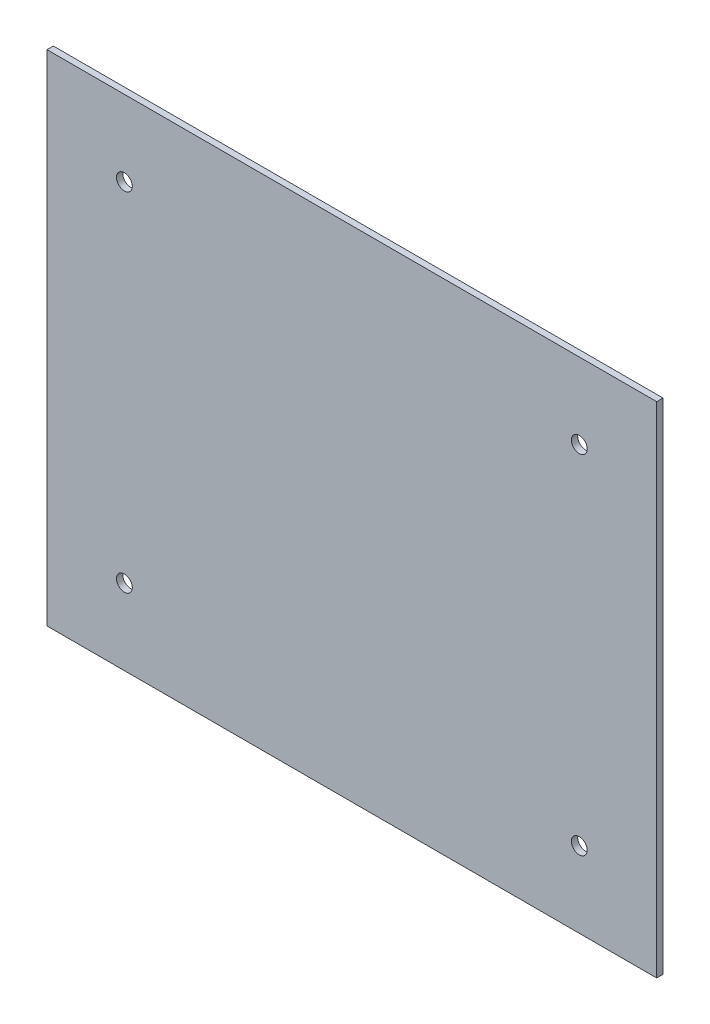
ISO-10303-21;
HEADER;
FILE_DESCRIPTION(('STEP AP214'),'2;1');
FILE_NAME('part.step','',(''),(''),'','','');
FILE_SCHEMA(('AUTOMOTIVE_DESIGN { 1 0 10303 214 1 1 1 1 }'));
ENDSEC;
DATA;
#1=APPLICATION_CONTEXT('core data for automotive mechanical design processes');
#2=APPLICATION_PROTOCOL_DEFINITION('international standard','automotive_design',2000,#1);
#3=PRODUCT_CONTEXT('',#1,'mechanical');
#4=PRODUCT('Part','Part','',(#3));
#5=PRODUCT_RELATED_PRODUCT_CATEGORY('part','',(#4));
#6=PRODUCT_DEFINITION_FORMATION('','',#4);
#7=PRODUCT_DEFINITION_CONTEXT('part definition',#1,'design');
#8=PRODUCT_DEFINITION('design','',#6,#7);
#9=PRODUCT_DEFINITION_SHAPE('','',#8);
#10=(LENGTH_UNIT() NAMED_UNIT(*) SI_UNIT(.MILLI.,.METRE.));
#11=(NAMED_UNIT(*) PLANE_ANGLE_UNIT() SI_UNIT($,.RADIAN.));
#12=(NAMED_UNIT(*) SI_UNIT($,.STERADIAN.) SOLID_ANGLE_UNIT());
#13=UNCERTAINTY_MEASURE_WITH_UNIT(LENGTH_MEASURE(1.E-05),#10,'distance_accuracy_value','');
#14=(GEOMETRIC_REPRESENTATION_CONTEXT(3) GLOBAL_UNCERTAINTY_ASSIGNED_CONTEXT((#13)) GLOBAL_UNIT_ASSIGNED_CONTEXT((#10,
#11,#12)) REPRESENTATION_CONTEXT('',''));
#15=CARTESIAN_POINT('',(0.,0.,0.));
#16=DIRECTION('',(0.,0.,1.));
#17=DIRECTION('',(1.,0.,0.));
#18=AXIS2_PLACEMENT_3D('',#15,#16,#17);
#19=CARTESIAN_POINT('',(0.,0.,1.));
#20=DIRECTION('',(0.,0.,1.));
#21=DIRECTION('',(1.,0.,0.));
#22=AXIS2_PLACEMENT_3D('',#19,#20,#21);
#23=PLANE('',#22);
#24=CARTESIAN_POINT('',(-72.,-55.,1.));
#25=DIRECTION('',(0.,0.,1.));
#26=DIRECTION('',(-1.,0.,0.));
#27=AXIS2_PLACEMENT_3D('',#24,#25,#26);
#28=CIRCLE('',#27,2.49999999999999);
#29=CARTESIAN_POINT('',(-74.5,-55.,1.));
#30=VERTEX_POINT('',#29);
#31=EDGE_CURVE('E115',#30,#30,#28,.T.);
#32=ORIENTED_EDGE('',*,*,#31,.F.);
#33=EDGE_LOOP('',(#32));
#34=FACE_BOUND('',#33,.T.);
#35=CARTESIAN_POINT('',(-72.,55.,1.));
#36=DIRECTION('',(0.,0.,1.));
#37=DIRECTION('',(-1.,0.,0.));
#38=AXIS2_PLACEMENT_3D('',#35,#36,#37);
#39=CIRCLE('',#38,2.49999999999999);
#40=CARTESIAN_POINT('',(-74.5,55.,1.));
#41=VERTEX_POINT('',#40);
#42=EDGE_CURVE('E121',#41,#41,#39,.T.);
#43=ORIENTED_EDGE('',*,*,#42,.F.);
#44=EDGE_LOOP('',(#43));
#45=FACE_BOUND('',#44,.T.);
#46=CARTESIAN_POINT('',(72.,55.,1.));
#47=DIRECTION('',(0.,0.,1.));
#48=DIRECTION('',(1.,0.,0.));
#49=AXIS2_PLACEMENT_3D('',#46,#47,#48);
#50=CIRCLE('',#49,2.49999999999999);
#51=CARTESIAN_POINT('',(74.5,55.,1.));
#52=VERTEX_POINT('',#51);
#53=EDGE_CURVE('E127',#52,#52,#50,.T.);
#54=ORIENTED_EDGE('',*,*,#53,.F.);
#55=EDGE_LOOP('',(#54));
#56=FACE_BOUND('',#55,.T.);
#57=CARTESIAN_POINT('',(72.,-55.,1.));
#58=DIRECTION('',(0.,0.,1.));
#59=DIRECTION('',(1.,0.,0.));
#60=AXIS2_PLACEMENT_3D('',#57,#58,#59);
#61=CIRCLE('',#60,2.49999999999999);
#62=CARTESIAN_POINT('',(74.5,-55.,1.));
#63=VERTEX_POINT('',#62);
#64=EDGE_CURVE('E109',#63,#63,#61,.T.);
#65=ORIENTED_EDGE('',*,*,#64,.F.);
#66=EDGE_LOOP('',(#65));
#67=FACE_BOUND('',#66,.T.);
#68=DIRECTION('',(0.,1.,0.));
#69=VECTOR('',#68,1.);
#70=CARTESIAN_POINT('',(96.5,79.,1.));
#71=LINE('',#70,#69);
#72=CARTESIAN_POINT('',(96.5,-79.,1.));
#73=VERTEX_POINT('',#72);
#74=CARTESIAN_POINT('',(96.5,79.,1.));
#75=VERTEX_POINT('',#74);
#76=EDGE_CURVE('E83',#73,#75,#71,.T.);
#77=ORIENTED_EDGE('',*,*,#76,.T.);
#78=DIRECTION('',(-1.,0.,0.));
#79=VECTOR('',#78,1.);
#80=CARTESIAN_POINT('',(-96.5,78.9999999999999,1.));
#81=LINE('',#80,#79);
#82=CARTESIAN_POINT('',(-96.5,78.9999999999999,1.));
#83=VERTEX_POINT('',#82);
#84=EDGE_CURVE('E79',#75,#83,#81,.T.);
#85=ORIENTED_EDGE('',*,*,#84,.T.);
#86=DIRECTION('',(0.,-1.,0.));
#87=VECTOR('',#86,1.);
#88=CARTESIAN_POINT('',(-96.5,78.9999999999999,1.));
#89=LINE('',#88,#87);
#90=CARTESIAN_POINT('',(-96.5,-79.,1.));
#91=VERTEX_POINT('',#90);
#92=EDGE_CURVE('E81',#83,#91,#89,.T.);
#93=ORIENTED_EDGE('',*,*,#92,.T.);
#94=DIRECTION('',(1.,0.,0.));
#95=VECTOR('',#94,1.);
#96=CARTESIAN_POINT('',(-96.5,-79.,1.));
#97=LINE('',#96,#95);
#98=EDGE_CURVE('E49',#91,#73,#97,.T.);
#99=ORIENTED_EDGE('',*,*,#98,.T.);
#100=EDGE_LOOP('',(#77,#85,#93,#99));
#101=FACE_BOUND('',#100,.T.);
#102=ADVANCED_FACE('F32',(#34,#45,#56,#67,#101),#23,.T.);
#103=CARTESIAN_POINT('',(0.,0.,-1.));
#104=DIRECTION('',(0.,0.,1.));
#105=DIRECTION('',(1.,0.,0.));
#106=AXIS2_PLACEMENT_3D('',#103,#104,#105);
#107=PLANE('',#106);
#108=CARTESIAN_POINT('',(-72.,-55.,-1.));
#109=DIRECTION('',(0.,0.,1.));
#110=DIRECTION('',(-1.,0.,0.));
#111=AXIS2_PLACEMENT_3D('',#108,#109,#110);
#112=CIRCLE('',#111,2.49999999999999);
#113=CARTESIAN_POINT('',(-74.5,-55.,-1.));
#114=VERTEX_POINT('',#113);
#115=EDGE_CURVE('E118',#114,#114,#112,.T.);
#116=ORIENTED_EDGE('',*,*,#115,.T.);
#117=EDGE_LOOP('',(#116));
#118=FACE_BOUND('',#117,.T.);
#119=CARTESIAN_POINT('',(-72.,55.,-1.));
#120=DIRECTION('',(0.,0.,1.));
#121=DIRECTION('',(-1.,0.,0.));
#122=AXIS2_PLACEMENT_3D('',#119,#120,#121);
#123=CIRCLE('',#122,2.49999999999999);
#124=CARTESIAN_POINT('',(-74.5,55.,-1.));
#125=VERTEX_POINT('',#124);
#126=EDGE_CURVE('E124',#125,#125,#123,.T.);
#127=ORIENTED_EDGE('',*,*,#126,.T.);
#128=EDGE_LOOP('',(#127));
#129=FACE_BOUND('',#128,.T.);
#130=CARTESIAN_POINT('',(72.,55.,-1.));
#131=DIRECTION('',(0.,0.,1.));
#132=DIRECTION('',(1.,0.,0.));
#133=AXIS2_PLACEMENT_3D('',#130,#131,#132);
#134=CIRCLE('',#133,2.49999999999999);
#135=CARTESIAN_POINT('',(74.5,55.,-1.));
#136=VERTEX_POINT('',#135);
#137=EDGE_CURVE('E112',#136,#136,#134,.T.);
#138=ORIENTED_EDGE('',*,*,#137,.T.);
#139=EDGE_LOOP('',(#138));
#140=FACE_BOUND('',#139,.T.);
#141=CARTESIAN_POINT('',(72.,-55.,-1.));
#142=DIRECTION('',(0.,0.,1.));
#143=DIRECTION('',(1.,0.,0.));
#144=AXIS2_PLACEMENT_3D('',#141,#142,#143);
#145=CIRCLE('',#144,2.49999999999999);
#146=CARTESIAN_POINT('',(74.5,-55.,-1.));
#147=VERTEX_POINT('',#146);
#148=EDGE_CURVE('E98',#147,#147,#145,.T.);
#149=ORIENTED_EDGE('',*,*,#148,.T.);
#150=EDGE_LOOP('',(#149));
#151=FACE_BOUND('',#150,.T.);
#152=DIRECTION('',(0.,1.,0.));
#153=VECTOR('',#152,1.);
#154=CARTESIAN_POINT('',(96.5,79.,-1.));
#155=LINE('',#154,#153);
#156=CARTESIAN_POINT('',(96.5,-79.,-1.));
#157=VERTEX_POINT('',#156);
#158=CARTESIAN_POINT('',(96.5,79.,-1.));
#159=VERTEX_POINT('',#158);
#160=EDGE_CURVE('E95',#157,#159,#155,.T.);
#161=ORIENTED_EDGE('',*,*,#160,.F.);
#162=DIRECTION('',(1.,0.,0.));
#163=VECTOR('',#162,1.);
#164=CARTESIAN_POINT('',(-96.5,-79.,-1.));
#165=LINE('',#164,#163);
#166=CARTESIAN_POINT('',(-96.5,-79.,-1.));
#167=VERTEX_POINT('',#166);
#168=EDGE_CURVE('E72',#167,#157,#165,.T.);
#169=ORIENTED_EDGE('',*,*,#168,.F.);
#170=DIRECTION('',(0.,-1.,0.));
#171=VECTOR('',#170,1.);
#172=CARTESIAN_POINT('',(-96.5,78.9999999999999,-1.));
#173=LINE('',#172,#171);
#174=CARTESIAN_POINT('',(-96.5,78.9999999999999,-1.));
#175=VERTEX_POINT('',#174);
#176=EDGE_CURVE('E66',#175,#167,#173,.T.);
#177=ORIENTED_EDGE('',*,*,#176,.F.);
#178=DIRECTION('',(-1.,0.,0.));
#179=VECTOR('',#178,1.);
#180=CARTESIAN_POINT('',(-96.5,78.9999999999999,-1.));
#181=LINE('',#180,#179);
#182=EDGE_CURVE('E87',#159,#175,#181,.T.);
#183=ORIENTED_EDGE('',*,*,#182,.F.);
#184=EDGE_LOOP('',(#161,#169,#177,#183));
#185=FACE_BOUND('',#184,.T.);
#186=ADVANCED_FACE('F106',(#118,#129,#140,#151,#185),#107,.F.);
#187=CARTESIAN_POINT('',(96.5,79.,1.));
#188=DIRECTION('',(-1.,0.,0.));
#189=DIRECTION('',(0.,0.,1.));
#190=AXIS2_PLACEMENT_3D('',#187,#188,#189);
#191=PLANE('',#190);
#192=ORIENTED_EDGE('',*,*,#160,.T.);
#193=DIRECTION('',(0.,0.,-1.));
#194=VECTOR('',#193,1.);
#195=CARTESIAN_POINT('',(96.5,79.,1.));
#196=LINE('',#195,#194);
#197=EDGE_CURVE('E11',#75,#159,#196,.T.);
#198=ORIENTED_EDGE('',*,*,#197,.F.);
#199=ORIENTED_EDGE('',*,*,#76,.F.);
#200=DIRECTION('',(0.,0.,-1.));
#201=VECTOR('',#200,1.);
#202=CARTESIAN_POINT('',(96.5,-79.,1.));
#203=LINE('',#202,#201);
#204=EDGE_CURVE('E91',#73,#157,#203,.T.);
#205=ORIENTED_EDGE('',*,*,#204,.T.);
#206=EDGE_LOOP('',(#192,#198,#199,#205));
#207=FACE_BOUND('',#206,.T.);
#208=ADVANCED_FACE('F34',(#207),#191,.F.);
#209=CARTESIAN_POINT('',(-96.5,78.9999999999999,1.));
#210=DIRECTION('',(0.,-1.,0.));
#211=DIRECTION('',(1.,0.,0.));
#212=AXIS2_PLACEMENT_3D('',#209,#210,#211);
#213=PLANE('',#212);
#214=ORIENTED_EDGE('',*,*,#182,.T.);
#215=DIRECTION('',(0.,0.,-1.));
#216=VECTOR('',#215,1.);
#217=CARTESIAN_POINT('',(-96.5,78.9999999999999,1.));
#218=LINE('',#217,#216);
#219=EDGE_CURVE('E41',#83,#175,#218,.T.);
#220=ORIENTED_EDGE('',*,*,#219,.F.);
#221=ORIENTED_EDGE('',*,*,#84,.F.);
#222=ORIENTED_EDGE('',*,*,#197,.T.);
#223=EDGE_LOOP('',(#214,#220,#221,#222));
#224=FACE_BOUND('',#223,.T.);
#225=ADVANCED_FACE('F86',(#224),#213,.F.);
#226=CARTESIAN_POINT('',(-96.5,78.9999999999999,1.));
#227=DIRECTION('',(1.,0.,0.));
#228=DIRECTION('',(0.,0.,-1.));
#229=AXIS2_PLACEMENT_3D('',#226,#227,#228);
#230=PLANE('',#229);
#231=ORIENTED_EDGE('',*,*,#176,.T.);
#232=DIRECTION('',(0.,0.,-1.));
#233=VECTOR('',#232,1.);
#234=CARTESIAN_POINT('',(-96.5,-79.,1.));
#235=LINE('',#234,#233);
#236=EDGE_CURVE('E88',#91,#167,#235,.T.);
#237=ORIENTED_EDGE('',*,*,#236,.F.);
#238=ORIENTED_EDGE('',*,*,#92,.F.);
#239=ORIENTED_EDGE('',*,*,#219,.T.);
#240=EDGE_LOOP('',(#231,#237,#238,#239));
#241=FACE_BOUND('',#240,.T.);
#242=ADVANCED_FACE('F89',(#241),#230,.F.);
#243=CARTESIAN_POINT('',(-96.5,-79.,1.));
#244=DIRECTION('',(0.,1.,0.));
#245=DIRECTION('',(0.,0.,1.));
#246=AXIS2_PLACEMENT_3D('',#243,#244,#245);
#247=PLANE('',#246);
#248=ORIENTED_EDGE('',*,*,#168,.T.);
#249=ORIENTED_EDGE('',*,*,#204,.F.);
#250=ORIENTED_EDGE('',*,*,#98,.F.);
#251=ORIENTED_EDGE('',*,*,#236,.T.);
#252=EDGE_LOOP('',(#248,#249,#250,#251));
#253=FACE_BOUND('',#252,.T.);
#254=ADVANCED_FACE('F103',(#253),#247,.F.);
#255=CARTESIAN_POINT('',(72.,-55.,-1.));
#256=DIRECTION('',(0.,0.,1.));
#257=DIRECTION('',(1.,0.,0.));
#258=AXIS2_PLACEMENT_3D('',#255,#256,#257);
#259=CYLINDRICAL_SURFACE('',#258,2.49999999999999);
#260=ORIENTED_EDGE('',*,*,#148,.F.);
#261=EDGE_LOOP('',(#260));
#262=FACE_BOUND('',#261,.T.);
#263=ORIENTED_EDGE('',*,*,#64,.T.);
#264=EDGE_LOOP('',(#263));
#265=FACE_BOUND('',#264,.T.);
#266=ADVANCED_FACE('F139',(#262,#265),#259,.F.);
#267=CARTESIAN_POINT('',(72.,55.,-1.));
#268=DIRECTION('',(0.,0.,1.));
#269=DIRECTION('',(1.,0.,0.));
#270=AXIS2_PLACEMENT_3D('',#267,#268,#269);
#271=CYLINDRICAL_SURFACE('',#270,2.49999999999999);
#272=ORIENTED_EDGE('',*,*,#137,.F.);
#273=EDGE_LOOP('',(#272));
#274=FACE_BOUND('',#273,.T.);
#275=ORIENTED_EDGE('',*,*,#53,.T.);
#276=EDGE_LOOP('',(#275));
#277=FACE_BOUND('',#276,.T.);
#278=ADVANCED_FACE('F135',(#274,#277),#271,.F.);
#279=CARTESIAN_POINT('',(-72.,55.,-1.));
#280=DIRECTION('',(0.,0.,1.));
#281=DIRECTION('',(1.,0.,0.));
#282=AXIS2_PLACEMENT_3D('',#279,#280,#281);
#283=CYLINDRICAL_SURFACE('',#282,2.49999999999999);
#284=ORIENTED_EDGE('',*,*,#126,.F.);
#285=EDGE_LOOP('',(#284));
#286=FACE_BOUND('',#285,.T.);
#287=ORIENTED_EDGE('',*,*,#42,.T.);
#288=EDGE_LOOP('',(#287));
#289=FACE_BOUND('',#288,.T.);
#290=ADVANCED_FACE('F138',(#286,#289),#283,.F.);
#291=CARTESIAN_POINT('',(-72.,-55.,-1.));
#292=DIRECTION('',(0.,0.,1.));
#293=DIRECTION('',(1.,0.,0.));
#294=AXIS2_PLACEMENT_3D('',#291,#292,#293);
#295=CYLINDRICAL_SURFACE('',#294,2.49999999999999);
#296=ORIENTED_EDGE('',*,*,#115,.F.);
#297=EDGE_LOOP('',(#296));
#298=FACE_BOUND('',#297,.T.);
#299=ORIENTED_EDGE('',*,*,#31,.T.);
#300=EDGE_LOOP('',(#299));
#301=FACE_BOUND('',#300,.T.);
#302=ADVANCED_FACE('F158',(#298,#301),#295,.F.);
#303=CLOSED_SHELL('',(#102,#186,#208,#225,#242,#254,#266,#278,#290,#302));
#304=MANIFOLD_SOLID_BREP('B2',#303);
#305=ADVANCED_BREP_SHAPE_REPRESENTATION('',(#18,#304),#14);
#306=SHAPE_DEFINITION_REPRESENTATION(#9,#305);
ENDSEC;
END-ISO-10303-21;
